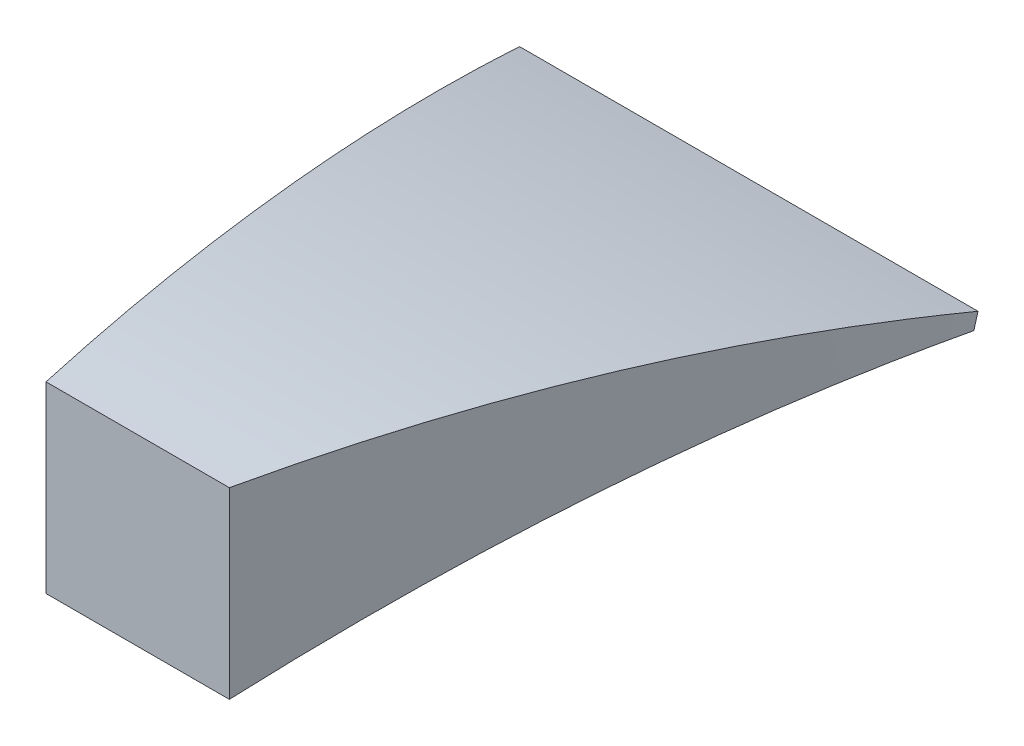
ISO-10303-21;
HEADER;
FILE_DESCRIPTION(('STEP AP214'),'2;1');
FILE_NAME('part.step','',(''),(''),'','','');
FILE_SCHEMA(('AUTOMOTIVE_DESIGN { 1 0 10303 214 1 1 1 1 }'));
ENDSEC;
DATA;
#1=APPLICATION_CONTEXT('core data for automotive mechanical design processes');
#2=APPLICATION_PROTOCOL_DEFINITION('international standard','automotive_design',2000,#1);
#3=PRODUCT_CONTEXT('',#1,'mechanical');
#4=PRODUCT('Part','Part','',(#3));
#5=PRODUCT_RELATED_PRODUCT_CATEGORY('part','',(#4));
#6=PRODUCT_DEFINITION_FORMATION('','',#4);
#7=PRODUCT_DEFINITION_CONTEXT('part definition',#1,'design');
#8=PRODUCT_DEFINITION('design','',#6,#7);
#9=PRODUCT_DEFINITION_SHAPE('','',#8);
#10=(LENGTH_UNIT() NAMED_UNIT(*) SI_UNIT(.MILLI.,.METRE.));
#11=(NAMED_UNIT(*) PLANE_ANGLE_UNIT() SI_UNIT($,.RADIAN.));
#12=(NAMED_UNIT(*) SI_UNIT($,.STERADIAN.) SOLID_ANGLE_UNIT());
#13=UNCERTAINTY_MEASURE_WITH_UNIT(LENGTH_MEASURE(1.E-05),#10,'distance_accuracy_value','');
#14=(GEOMETRIC_REPRESENTATION_CONTEXT(3) GLOBAL_UNCERTAINTY_ASSIGNED_CONTEXT((#13)) GLOBAL_UNIT_ASSIGNED_CONTEXT((#10,
#11,#12)) REPRESENTATION_CONTEXT('',''));
#15=CARTESIAN_POINT('',(0.,0.,0.));
#16=DIRECTION('',(0.,0.,1.));
#17=DIRECTION('',(1.,0.,0.));
#18=AXIS2_PLACEMENT_3D('',#15,#16,#17);
#19=CARTESIAN_POINT('',(0.,-51.7941151563906,-184.781391515329));
#20=DIRECTION('',(0.,0.269897255022234,0.962889127434443));
#21=DIRECTION('',(0.,-0.962889127434443,0.269897255022234));
#22=AXIS2_PLACEMENT_3D('',#19,#20,#21);
#23=PLANE('',#22);
#24=DIRECTION('',(0.,-0.962889127434443,0.269897255022234));
#25=VECTOR('',#24,1.);
#26=CARTESIAN_POINT('',(75.,2.5,-200.));
#27=LINE('',#26,#25);
#28=CARTESIAN_POINT('',(75.,2.5,-200.));
#29=VERTEX_POINT('',#28);
#30=CARTESIAN_POINT('',(75.,-2.31444563717221,-198.650513724889));
#31=VERTEX_POINT('',#30);
#32=EDGE_CURVE('E266',#29,#31,#27,.T.);
#33=ORIENTED_EDGE('',*,*,#32,.T.);
#34=DIRECTION('',(-1.,0.,0.));
#35=VECTOR('',#34,1.);
#36=CARTESIAN_POINT('',(-75.,-2.31444563717221,-198.650513724889));
#37=LINE('',#36,#35);
#38=CARTESIAN_POINT('',(-75.,-2.31444563717221,-198.650513724889));
#39=VERTEX_POINT('',#38);
#40=EDGE_CURVE('E261',#31,#39,#37,.T.);
#41=ORIENTED_EDGE('',*,*,#40,.T.);
#42=DIRECTION('',(0.,0.962889127434443,-0.269897255022234));
#43=VECTOR('',#42,1.);
#44=CARTESIAN_POINT('',(-75.,2.5,-200.));
#45=LINE('',#44,#43);
#46=CARTESIAN_POINT('',(-75.,2.5,-200.));
#47=VERTEX_POINT('',#46);
#48=EDGE_CURVE('E134',#39,#47,#45,.T.);
#49=ORIENTED_EDGE('',*,*,#48,.T.);
#50=DIRECTION('',(1.,0.,0.));
#51=VECTOR('',#50,1.);
#52=CARTESIAN_POINT('',(-75.,2.5,-200.));
#53=LINE('',#52,#51);
#54=EDGE_CURVE('E13',#47,#29,#53,.T.);
#55=ORIENTED_EDGE('',*,*,#54,.T.);
#56=EDGE_LOOP('',(#33,#41,#49,#55));
#57=FACE_BOUND('',#56,.T.);
#58=ADVANCED_FACE('F124',(#57),#23,.F.);
#59=CARTESIAN_POINT('',(0.,0.,0.));
#60=DIRECTION('',(0.,0.,-1.));
#61=DIRECTION('',(-1.,0.,0.));
#62=AXIS2_PLACEMENT_3D('',#59,#60,#61);
#63=PLANE('',#62);
#64=DIRECTION('',(0.,1.,0.));
#65=VECTOR('',#64,1.);
#66=CARTESIAN_POINT('',(30.,-30.,0.));
#67=LINE('',#66,#65);
#68=CARTESIAN_POINT('',(30.,-30.,0.));
#69=VERTEX_POINT('',#68);
#70=CARTESIAN_POINT('',(30.,30.,0.));
#71=VERTEX_POINT('',#70);
#72=EDGE_CURVE('E234',#69,#71,#67,.T.);
#73=ORIENTED_EDGE('',*,*,#72,.T.);
#74=DIRECTION('',(-1.,0.,0.));
#75=VECTOR('',#74,1.);
#76=CARTESIAN_POINT('',(-30.,30.,0.));
#77=LINE('',#76,#75);
#78=CARTESIAN_POINT('',(-30.,30.,0.));
#79=VERTEX_POINT('',#78);
#80=EDGE_CURVE('E191',#71,#79,#77,.T.);
#81=ORIENTED_EDGE('',*,*,#80,.T.);
#82=DIRECTION('',(0.,-1.,0.));
#83=VECTOR('',#82,1.);
#84=CARTESIAN_POINT('',(-30.,-30.,0.));
#85=LINE('',#84,#83);
#86=CARTESIAN_POINT('',(-30.,-30.,0.));
#87=VERTEX_POINT('',#86);
#88=EDGE_CURVE('E170',#79,#87,#85,.T.);
#89=ORIENTED_EDGE('',*,*,#88,.T.);
#90=DIRECTION('',(1.,0.,0.));
#91=VECTOR('',#90,1.);
#92=CARTESIAN_POINT('',(-30.,-30.,0.));
#93=LINE('',#92,#91);
#94=EDGE_CURVE('E178',#87,#69,#93,.T.);
#95=ORIENTED_EDGE('',*,*,#94,.T.);
#96=EDGE_LOOP('',(#73,#81,#89,#95));
#97=FACE_BOUND('',#96,.T.);
#98=ADVANCED_FACE('F190',(#97),#63,.F.);
#99=CARTESIAN_POINT('',(-30.,30.,0.));
#100=CARTESIAN_POINT('',(-45.,29.9999999999999,-67.607499241853));
#101=CARTESIAN_POINT('',(-60.,20.747078464294,-134.901474046987));
#102=CARTESIAN_POINT('',(-75.,2.5,-200.));
#103=CARTESIAN_POINT('',(-25.6528662420382,30.,0.));
#104=CARTESIAN_POINT('',(-40.8138711960368,29.9999999999999,-67.607499241853));
#105=CARTESIAN_POINT('',(-55.9748761500354,20.747078464294,-134.901474046987));
#106=CARTESIAN_POINT('',(-71.135881104034,2.5,-200.));
#107=CARTESIAN_POINT('',(-20.5777996377027,30.,0.));
#108=CARTESIAN_POINT('',(-34.5363167686436,29.9999999999999,-67.6074992418529));
#109=CARTESIAN_POINT('',(-48.4948338995846,20.747078464294,-134.901474046987));
#110=CARTESIAN_POINT('',(-62.4533510305256,2.5,-200.));
#111=CARTESIAN_POINT('',(-13.4056611634378,30.,0.));
#112=CARTESIAN_POINT('',(-24.034118466912,29.9999999999999,-67.607499241853));
#113=CARTESIAN_POINT('',(-34.6625757703862,20.747078464294,-134.901474046987));
#114=CARTESIAN_POINT('',(-45.2910330738604,2.5,-200.));
#115=CARTESIAN_POINT('',(-7.07528631025082,30.,0.));
#116=CARTESIAN_POINT('',(-11.7746246640858,29.9999999999999,-67.6074992418529));
#117=CARTESIAN_POINT('',(-16.4739630179209,20.747078464294,-134.901474046987));
#118=CARTESIAN_POINT('',(-21.1733013717559,2.5,-200.));
#119=CARTESIAN_POINT('',(-2.50000000000001,30.,0.));
#120=CARTESIAN_POINT('',(-3.75,29.9999999999999,-67.607499241853));
#121=CARTESIAN_POINT('',(-5.,20.747078464294,-134.901474046987));
#122=CARTESIAN_POINT('',(-6.25,2.5,-200.));
#123=CARTESIAN_POINT('',(2.49999999999999,30.,0.));
#124=CARTESIAN_POINT('',(3.75,29.9999999999999,-67.607499241853));
#125=CARTESIAN_POINT('',(5.,20.747078464294,-134.901474046987));
#126=CARTESIAN_POINT('',(6.25,2.5,-200.));
#127=CARTESIAN_POINT('',(7.07528631025077,30.,0.));
#128=CARTESIAN_POINT('',(11.7746246640858,29.9999999999999,-67.607499241853));
#129=CARTESIAN_POINT('',(16.4739630179209,20.747078464294,-134.901474046987));
#130=CARTESIAN_POINT('',(21.1733013717559,2.5,-200.));
#131=CARTESIAN_POINT('',(13.4056611634379,30.,0.));
#132=CARTESIAN_POINT('',(24.0341184669121,29.9999999999999,-67.607499241853));
#133=CARTESIAN_POINT('',(34.6625757703863,20.747078464294,-134.901474046987));
#134=CARTESIAN_POINT('',(45.2910330738605,2.5,-200.));
#135=CARTESIAN_POINT('',(20.5777996377026,30.,0.));
#136=CARTESIAN_POINT('',(34.5363167686436,29.9999999999999,-67.607499241853));
#137=CARTESIAN_POINT('',(48.4948338995846,20.747078464294,-134.901474046987));
#138=CARTESIAN_POINT('',(62.4533510305257,2.5,-200.));
#139=CARTESIAN_POINT('',(25.6528662420382,30.,0.));
#140=CARTESIAN_POINT('',(40.8138711960368,29.9999999999999,-67.607499241853));
#141=CARTESIAN_POINT('',(55.9748761500354,20.747078464294,-134.901474046987));
#142=CARTESIAN_POINT('',(71.135881104034,2.5,-200.));
#143=CARTESIAN_POINT('',(30.,30.,0.));
#144=CARTESIAN_POINT('',(45.,29.9999999999999,-67.607499241853));
#145=CARTESIAN_POINT('',(60.,20.747078464294,-134.901474046987));
#146=CARTESIAN_POINT('',(75.,2.5,-200.));
#147=B_SPLINE_SURFACE_WITH_KNOTS('',3,3,((#99,#100,#101,#102),(#103,#104,#105,#106),(#107,#108,
#109,#110),(#111,#112,#113,#114),(#115,#116,#117,#118),(#119,#120,#121,#122),(#123,#124,#125,
#126),(#127,#128,#129,#130),(#131,#132,#133,#134),(#135,#136,#137,#138),(#139,#140,#141,#142),
(#143,#144,#145,#146)),.UNSPECIFIED.,.F.,.F.,.F.,(4,1,1,1,2,1,1,1,4),(4,4),(0.633064516129032,
0.678931451612903,0.724798387096774,0.770665322580645,0.816532258064516,0.862399193548387,
0.908266129032258,0.954133064516129,1.),(0.,1.),.UNSPECIFIED.);
#148=CARTESIAN_POINT('',(30.,30.,0.));
#149=CARTESIAN_POINT('',(45.,29.9999999999999,-67.607499241853));
#150=CARTESIAN_POINT('',(60.,20.747078464294,-134.901474046987));
#151=CARTESIAN_POINT('',(75.,2.5,-200.));
#152=B_SPLINE_CURVE_WITH_KNOTS('',3,(#148,#149,#150,#151),.UNSPECIFIED.,.F.,.F.,(4,4),(0.,1.),.UNSPECIFIED.);
#153=EDGE_CURVE('E273',#71,#29,#152,.T.);
#154=CARTESIAN_POINT('',(-30.,30.,0.));
#155=CARTESIAN_POINT('',(-45.,29.9999999999999,-67.607499241853));
#156=CARTESIAN_POINT('',(-60.,20.747078464294,-134.901474046987));
#157=CARTESIAN_POINT('',(-75.,2.5,-200.));
#158=B_SPLINE_CURVE_WITH_KNOTS('',3,(#154,#155,#156,#157),.UNSPECIFIED.,.F.,.F.,(4,4),(0.,1.),.UNSPECIFIED.);
#159=EDGE_CURVE('E149',#79,#47,#158,.T.);
#160=ORIENTED_EDGE('',*,*,#80,.F.);
#161=ORIENTED_EDGE('',*,*,#153,.T.);
#162=ORIENTED_EDGE('',*,*,#54,.F.);
#163=ORIENTED_EDGE('',*,*,#159,.F.);
#164=EDGE_LOOP('',(#160,#161,#162,#163));
#165=FACE_BOUND('',#164,.T.);
#166=ADVANCED_FACE('F210',(#165),#147,.T.);
#167=CARTESIAN_POINT('',(-30.,-30.,0.));
#168=CARTESIAN_POINT('',(-45.,-11.6048152123908,-67.1576704834826));
#169=CARTESIAN_POINT('',(-60.,-2.46255196048745,-134.001816530247));
#170=CARTESIAN_POINT('',(-75.,-2.31444563717221,-198.650513724889));
#171=CARTESIAN_POINT('',(-30.,-25.,0.));
#172=CARTESIAN_POINT('',(-45.,-8.13774727802493,-67.1951562133468));
#173=CARTESIAN_POINT('',(-60.,-0.528416091755664,-134.076787989975));
#174=CARTESIAN_POINT('',(-75.,-1.91324183407453,-198.762970914481));
#175=CARTESIAN_POINT('',(-30.,-15.,0.));
#176=CARTESIAN_POINT('',(-45.,-1.20361140929313,-67.2701276730752));
#177=CARTESIAN_POINT('',(-60.,3.33985564570792,-134.226730909432));
#178=CARTESIAN_POINT('',(-75.,-1.11083422787916,-198.987885293667));
#179=CARTESIAN_POINT('',(-30.,0.,0.));
#180=CARTESIAN_POINT('',(-45.,9.19759239380454,-67.3825848626678));
#181=CARTESIAN_POINT('',(-60.0000000000001,9.14226325190328,-134.451645288617));
#182=CARTESIAN_POINT('',(-75.0000000000001,0.0927771814138929,-199.325256862444));
#183=CARTESIAN_POINT('',(-30.,15.,0.));
#184=CARTESIAN_POINT('',(-45.,19.5987961969022,-67.4950420522604));
#185=CARTESIAN_POINT('',(-60.,14.9446708580987,-134.676559667802));
#186=CARTESIAN_POINT('',(-75.,1.29638859070695,-199.662628431222));
#187=CARTESIAN_POINT('',(-30.,25.,0.));
#188=CARTESIAN_POINT('',(-45.,26.532932065634,-67.5700135119888));
#189=CARTESIAN_POINT('',(-60.,18.8129425955622,-134.826502587259));
#190=CARTESIAN_POINT('',(-75.,2.09879619690232,-199.887542810407));
#191=CARTESIAN_POINT('',(-30.,30.,0.));
#192=CARTESIAN_POINT('',(-45.,29.9999999999999,-67.607499241853));
#193=CARTESIAN_POINT('',(-60.,20.747078464294,-134.901474046987));
#194=CARTESIAN_POINT('',(-75.,2.5,-200.));
#195=B_SPLINE_SURFACE_WITH_KNOTS('',3,3,((#167,#168,#169,#170),(#171,#172,#173,#174),(#175,#176,
#177,#178),(#179,#180,#181,#182),(#183,#184,#185,#186),(#187,#188,#189,#190),(#191,#192,#193,
#194)),.UNSPECIFIED.,.F.,.F.,.F.,(4,1,1,1,4),(4,4),(0.5,0.533266129032258,0.566532258064516,
0.599798387096774,0.633064516129032),(0.,1.),.UNSPECIFIED.);
#196=CARTESIAN_POINT('',(-30.,-30.,0.));
#197=CARTESIAN_POINT('',(-45.,-11.6048152123908,-67.1576704834826));
#198=CARTESIAN_POINT('',(-60.,-2.46255196048745,-134.001816530247));
#199=CARTESIAN_POINT('',(-75.,-2.31444563717221,-198.650513724889));
#200=B_SPLINE_CURVE_WITH_KNOTS('',3,(#196,#197,#198,#199),.UNSPECIFIED.,.F.,.F.,(4,4),(0.,1.),.UNSPECIFIED.);
#201=EDGE_CURVE('E166',#87,#39,#200,.T.);
#202=ORIENTED_EDGE('',*,*,#88,.F.);
#203=ORIENTED_EDGE('',*,*,#159,.T.);
#204=ORIENTED_EDGE('',*,*,#48,.F.);
#205=ORIENTED_EDGE('',*,*,#201,.F.);
#206=EDGE_LOOP('',(#202,#203,#204,#205));
#207=FACE_BOUND('',#206,.T.);
#208=ADVANCED_FACE('F168',(#207),#195,.T.);
#209=CARTESIAN_POINT('',(30.,-30.,0.));
#210=CARTESIAN_POINT('',(45.,-11.6048152123908,-67.1576704834826));
#211=CARTESIAN_POINT('',(60.,-2.46255196048745,-134.001816530247));
#212=CARTESIAN_POINT('',(75.,-2.31444563717221,-198.650513724889));
#213=CARTESIAN_POINT('',(25.,-30.,0.));
#214=CARTESIAN_POINT('',(37.5,-11.6048152123908,-67.1576704834826));
#215=CARTESIAN_POINT('',(50.,-2.46255196048745,-134.001816530247));
#216=CARTESIAN_POINT('',(62.5,-2.31444563717221,-198.650513724889));
#217=CARTESIAN_POINT('',(15.,-30.,0.));
#218=CARTESIAN_POINT('',(22.5,-11.6048152123908,-67.1576704834826));
#219=CARTESIAN_POINT('',(30.,-2.46255196048746,-134.001816530247));
#220=CARTESIAN_POINT('',(37.5,-2.31444563717221,-198.650513724889));
#221=CARTESIAN_POINT('',(0.,-30.,0.));
#222=CARTESIAN_POINT('',(0.,-11.6048152123908,-67.1576704834827));
#223=CARTESIAN_POINT('',(0.,-2.46255196048746,-134.001816530247));
#224=CARTESIAN_POINT('',(0.,-2.31444563717222,-198.650513724889));
#225=CARTESIAN_POINT('',(-15.,-30.,0.));
#226=CARTESIAN_POINT('',(-22.5,-11.6048152123908,-67.1576704834826));
#227=CARTESIAN_POINT('',(-30.,-2.46255196048745,-134.001816530247));
#228=CARTESIAN_POINT('',(-37.5,-2.31444563717221,-198.650513724889));
#229=CARTESIAN_POINT('',(-25.,-30.,0.));
#230=CARTESIAN_POINT('',(-37.5,-11.6048152123908,-67.1576704834826));
#231=CARTESIAN_POINT('',(-50.,-2.46255196048745,-134.001816530247));
#232=CARTESIAN_POINT('',(-62.5,-2.31444563717221,-198.650513724889));
#233=CARTESIAN_POINT('',(-30.,-30.,0.));
#234=CARTESIAN_POINT('',(-45.,-11.6048152123908,-67.1576704834826));
#235=CARTESIAN_POINT('',(-60.,-2.46255196048745,-134.001816530247));
#236=CARTESIAN_POINT('',(-75.,-2.31444563717221,-198.650513724889));
#237=B_SPLINE_SURFACE_WITH_KNOTS('',3,3,((#209,#210,#211,#212),(#213,#214,#215,#216),(#217,#218,
#219,#220),(#221,#222,#223,#224),(#225,#226,#227,#228),(#229,#230,#231,#232),(#233,#234,#235,
#236)),.UNSPECIFIED.,.F.,.F.,.F.,(4,1,1,1,4),(4,4),(0.133064516129032,0.224798387096774,
0.316532258064516,0.408266129032258,0.5),(0.,1.),.UNSPECIFIED.);
#238=CARTESIAN_POINT('',(30.,-30.,0.));
#239=CARTESIAN_POINT('',(45.,-11.6048152123908,-67.1576704834826));
#240=CARTESIAN_POINT('',(60.,-2.46255196048745,-134.001816530247));
#241=CARTESIAN_POINT('',(75.,-2.31444563717221,-198.650513724889));
#242=B_SPLINE_CURVE_WITH_KNOTS('',3,(#238,#239,#240,#241),.UNSPECIFIED.,.F.,.F.,(4,4),(0.,1.),.UNSPECIFIED.);
#243=EDGE_CURVE('E175',#69,#31,#242,.T.);
#244=ORIENTED_EDGE('',*,*,#94,.F.);
#245=ORIENTED_EDGE('',*,*,#201,.T.);
#246=ORIENTED_EDGE('',*,*,#40,.F.);
#247=ORIENTED_EDGE('',*,*,#243,.F.);
#248=EDGE_LOOP('',(#244,#245,#246,#247));
#249=FACE_BOUND('',#248,.T.);
#250=ADVANCED_FACE('F180',(#249),#237,.T.);
#251=CARTESIAN_POINT('',(30.,30.,0.));
#252=CARTESIAN_POINT('',(45.,29.9999999999999,-67.607499241853));
#253=CARTESIAN_POINT('',(60.,20.747078464294,-134.901474046987));
#254=CARTESIAN_POINT('',(75.,2.5,-200.));
#255=CARTESIAN_POINT('',(30.,25.,0.));
#256=CARTESIAN_POINT('',(45.,26.532932065634,-67.5700135119888));
#257=CARTESIAN_POINT('',(60.,18.8129425955622,-134.826502587259));
#258=CARTESIAN_POINT('',(75.,2.09879619690232,-199.887542810407));
#259=CARTESIAN_POINT('',(30.,15.,0.));
#260=CARTESIAN_POINT('',(45.,19.5987961969022,-67.4950420522605));
#261=CARTESIAN_POINT('',(60.,14.9446708580987,-134.676559667802));
#262=CARTESIAN_POINT('',(75.,1.29638859070695,-199.662628431222));
#263=CARTESIAN_POINT('',(30.,0.,0.));
#264=CARTESIAN_POINT('',(45.,9.19759239380454,-67.3825848626678));
#265=CARTESIAN_POINT('',(60.,9.14226325190328,-134.451645288617));
#266=CARTESIAN_POINT('',(75.,0.0927771814138919,-199.325256862444));
#267=CARTESIAN_POINT('',(30.,-15.,0.));
#268=CARTESIAN_POINT('',(45.,-1.20361140929314,-67.2701276730752));
#269=CARTESIAN_POINT('',(60.,3.33985564570792,-134.226730909432));
#270=CARTESIAN_POINT('',(75.,-1.11083422787916,-198.987885293667));
#271=CARTESIAN_POINT('',(30.,-25.,0.));
#272=CARTESIAN_POINT('',(45.,-8.13774727802493,-67.1951562133468));
#273=CARTESIAN_POINT('',(60.,-0.528416091755664,-134.076787989975));
#274=CARTESIAN_POINT('',(75.,-1.91324183407453,-198.762970914481));
#275=CARTESIAN_POINT('',(30.,-30.,0.));
#276=CARTESIAN_POINT('',(45.,-11.6048152123908,-67.1576704834826));
#277=CARTESIAN_POINT('',(60.,-2.46255196048745,-134.001816530247));
#278=CARTESIAN_POINT('',(75.,-2.31444563717221,-198.650513724889));
#279=B_SPLINE_SURFACE_WITH_KNOTS('',3,3,((#251,#252,#253,#254),(#255,#256,#257,#258),(#259,#260,
#261,#262),(#263,#264,#265,#266),(#267,#268,#269,#270),(#271,#272,#273,#274),(#275,#276,#277,
#278)),.UNSPECIFIED.,.F.,.F.,.F.,(4,1,1,1,4),(4,4),(0.,0.0332661290322581,0.0665322580645161,
0.0997983870967742,0.133064516129032),(0.,1.),.UNSPECIFIED.);
#280=ORIENTED_EDGE('',*,*,#72,.F.);
#281=ORIENTED_EDGE('',*,*,#243,.T.);
#282=ORIENTED_EDGE('',*,*,#32,.F.);
#283=ORIENTED_EDGE('',*,*,#153,.F.);
#284=EDGE_LOOP('',(#280,#281,#282,#283));
#285=FACE_BOUND('',#284,.T.);
#286=ADVANCED_FACE('F211',(#285),#279,.T.);
#287=CLOSED_SHELL('',(#58,#98,#166,#208,#250,#286));
#288=MANIFOLD_SOLID_BREP('B2',#287);
#289=ADVANCED_BREP_SHAPE_REPRESENTATION('',(#18,#288),#14);
#290=SHAPE_DEFINITION_REPRESENTATION(#9,#289);
ENDSEC;
END-ISO-10303-21;
